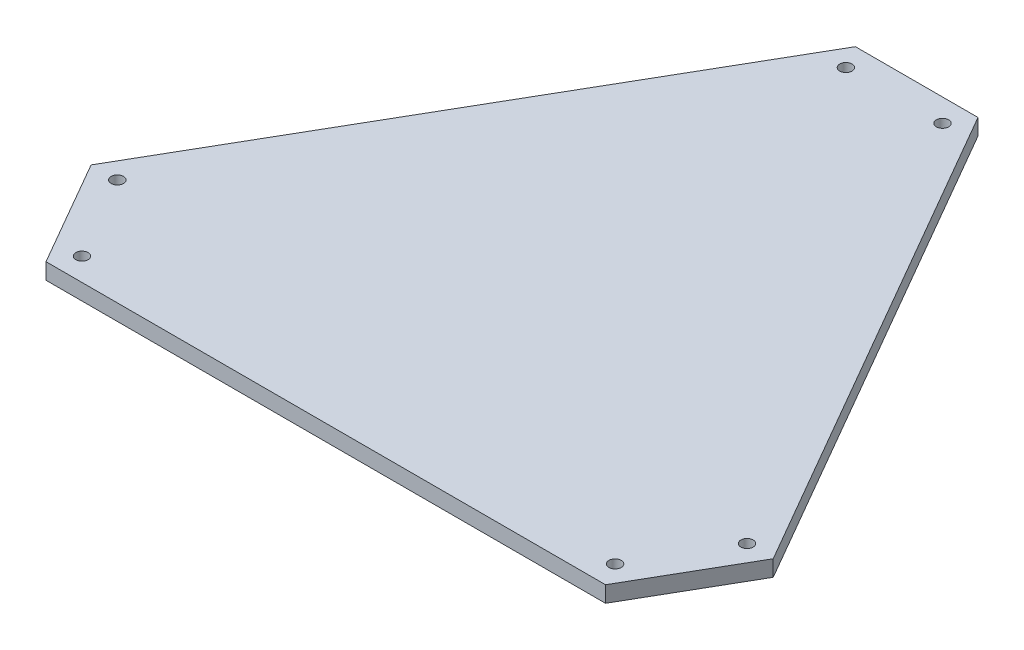
ISO-10303-21;
HEADER;
FILE_DESCRIPTION(('STEP AP214'),'2;1');
FILE_NAME('part.step','',(''),(''),'','','');
FILE_SCHEMA(('AUTOMOTIVE_DESIGN { 1 0 10303 214 1 1 1 1 }'));
ENDSEC;
DATA;
#1=APPLICATION_CONTEXT('core data for automotive mechanical design processes');
#2=APPLICATION_PROTOCOL_DEFINITION('international standard','automotive_design',2000,#1);
#3=PRODUCT_CONTEXT('',#1,'mechanical');
#4=PRODUCT('Part','Part','',(#3));
#5=PRODUCT_RELATED_PRODUCT_CATEGORY('part','',(#4));
#6=PRODUCT_DEFINITION_FORMATION('','',#4);
#7=PRODUCT_DEFINITION_CONTEXT('part definition',#1,'design');
#8=PRODUCT_DEFINITION('design','',#6,#7);
#9=PRODUCT_DEFINITION_SHAPE('','',#8);
#10=(LENGTH_UNIT() NAMED_UNIT(*) SI_UNIT(.MILLI.,.METRE.));
#11=(NAMED_UNIT(*) PLANE_ANGLE_UNIT() SI_UNIT($,.RADIAN.));
#12=(NAMED_UNIT(*) SI_UNIT($,.STERADIAN.) SOLID_ANGLE_UNIT());
#13=UNCERTAINTY_MEASURE_WITH_UNIT(LENGTH_MEASURE(1.E-05),#10,'distance_accuracy_value','');
#14=(GEOMETRIC_REPRESENTATION_CONTEXT(3) GLOBAL_UNCERTAINTY_ASSIGNED_CONTEXT((#13)) GLOBAL_UNIT_ASSIGNED_CONTEXT((#10,
#11,#12)) REPRESENTATION_CONTEXT('',''));
#15=CARTESIAN_POINT('',(0.,0.,0.));
#16=DIRECTION('',(0.,0.,1.));
#17=DIRECTION('',(1.,0.,0.));
#18=AXIS2_PLACEMENT_3D('',#15,#16,#17);
#19=CARTESIAN_POINT('',(0.,3.,-129.9));
#20=DIRECTION('',(-0.866019052628739,0.,0.500011000363013));
#21=DIRECTION('',(0.500011000363013,0.,0.866019052628739));
#22=AXIS2_PLACEMENT_3D('',#19,#20,#21);
#23=PLANE('',#22);
#24=DIRECTION('',(-0.500011000363013,0.,-0.866019052628739));
#25=VECTOR('',#24,1.);
#26=CARTESIAN_POINT('',(0.,3.,-129.9));
#27=LINE('',#26,#25);
#28=CARTESIAN_POINT('',(63.5566639869683,3.,-19.8198579745709));
#29=VERTEX_POINT('',#28);
#30=CARTESIAN_POINT('',(11.421585635486,3.,-110.117813679338));
#31=VERTEX_POINT('',#30);
#32=EDGE_CURVE('E104',#29,#31,#27,.T.);
#33=ORIENTED_EDGE('',*,*,#32,.F.);
#34=DIRECTION('',(0.,1.,0.));
#35=VECTOR('',#34,1.);
#36=CARTESIAN_POINT('',(63.5566639869683,0.,-19.8198579745709));
#37=LINE('',#36,#35);
#38=CARTESIAN_POINT('',(63.5566639869683,0.,-19.8198579745709));
#39=VERTEX_POINT('',#38);
#40=EDGE_CURVE('E90',#39,#29,#37,.T.);
#41=ORIENTED_EDGE('',*,*,#40,.F.);
#42=DIRECTION('',(-0.500011000363013,0.,-0.866019052628739));
#43=VECTOR('',#42,1.);
#44=CARTESIAN_POINT('',(0.,0.,-129.9));
#45=LINE('',#44,#43);
#46=CARTESIAN_POINT('',(11.421585635486,0.,-110.117813679338));
#47=VERTEX_POINT('',#46);
#48=EDGE_CURVE('E102',#39,#47,#45,.T.);
#49=ORIENTED_EDGE('',*,*,#48,.T.);
#50=DIRECTION('',(0.,1.,0.));
#51=VECTOR('',#50,1.);
#52=CARTESIAN_POINT('',(11.421585635486,0.,-110.117813679338));
#53=LINE('',#52,#51);
#54=EDGE_CURVE('E120',#47,#31,#53,.T.);
#55=ORIENTED_EDGE('',*,*,#54,.T.);
#56=EDGE_LOOP('',(#33,#41,#49,#55));
#57=FACE_BOUND('',#56,.T.);
#58=ADVANCED_FACE('F36',(#57),#23,.F.);
#59=CARTESIAN_POINT('',(0.,3.,-129.9));
#60=DIRECTION('',(0.866019052628739,0.,0.500011000363013));
#61=DIRECTION('',(0.500011000363013,0.,-0.866019052628739));
#62=AXIS2_PLACEMENT_3D('',#59,#60,#61);
#63=PLANE('',#62);
#64=DIRECTION('',(-0.500011000363013,0.,0.866019052628739));
#65=VECTOR('',#64,1.);
#66=CARTESIAN_POINT('',(0.,0.,-129.9));
#67=LINE('',#66,#65);
#68=CARTESIAN_POINT('',(-11.421585635486,0.,-110.117813679338));
#69=VERTEX_POINT('',#68);
#70=CARTESIAN_POINT('',(-63.5566639869683,0.,-19.8198579745709));
#71=VERTEX_POINT('',#70);
#72=EDGE_CURVE('E110',#69,#71,#67,.T.);
#73=ORIENTED_EDGE('',*,*,#72,.T.);
#74=DIRECTION('',(0.,1.,0.));
#75=VECTOR('',#74,1.);
#76=CARTESIAN_POINT('',(-63.5566639869683,0.,-19.8198579745709));
#77=LINE('',#76,#75);
#78=CARTESIAN_POINT('',(-63.5566639869683,3.,-19.8198579745709));
#79=VERTEX_POINT('',#78);
#80=EDGE_CURVE('E52',#71,#79,#77,.T.);
#81=ORIENTED_EDGE('',*,*,#80,.T.);
#82=DIRECTION('',(-0.500011000363013,0.,0.866019052628739));
#83=VECTOR('',#82,1.);
#84=CARTESIAN_POINT('',(0.,3.,-129.9));
#85=LINE('',#84,#83);
#86=CARTESIAN_POINT('',(-11.421585635486,3.,-110.117813679338));
#87=VERTEX_POINT('',#86);
#88=EDGE_CURVE('E44',#87,#79,#85,.T.);
#89=ORIENTED_EDGE('',*,*,#88,.F.);
#90=DIRECTION('',(0.,1.,0.));
#91=VECTOR('',#90,1.);
#92=CARTESIAN_POINT('',(-11.421585635486,0.,-110.117813679338));
#93=LINE('',#92,#91);
#94=EDGE_CURVE('E118',#69,#87,#93,.T.);
#95=ORIENTED_EDGE('',*,*,#94,.F.);
#96=EDGE_LOOP('',(#73,#81,#89,#95));
#97=FACE_BOUND('',#96,.T.);
#98=ADVANCED_FACE('F186',(#97),#63,.F.);
#99=CARTESIAN_POINT('',(-75.,3.,0.));
#100=DIRECTION('',(0.,0.,-1.));
#101=DIRECTION('',(-1.,0.,0.));
#102=AXIS2_PLACEMENT_3D('',#99,#100,#101);
#103=PLANE('',#102);
#104=DIRECTION('',(1.,0.,0.));
#105=VECTOR('',#104,1.);
#106=CARTESIAN_POINT('',(-75.,0.,0.));
#107=LINE('',#106,#105);
#108=CARTESIAN_POINT('',(-52.1412157937842,0.,0.));
#109=VERTEX_POINT('',#108);
#110=CARTESIAN_POINT('',(52.1282053195307,0.,0.));
#111=VERTEX_POINT('',#110);
#112=EDGE_CURVE('E39',#109,#111,#107,.T.);
#113=ORIENTED_EDGE('',*,*,#112,.T.);
#114=DIRECTION('',(0.,1.,0.));
#115=VECTOR('',#114,1.);
#116=CARTESIAN_POINT('',(52.1282053195307,0.,0.));
#117=LINE('',#116,#115);
#118=CARTESIAN_POINT('',(52.1282053195307,3.,0.));
#119=VERTEX_POINT('',#118);
#120=EDGE_CURVE('E60',#111,#119,#117,.T.);
#121=ORIENTED_EDGE('',*,*,#120,.T.);
#122=DIRECTION('',(1.,0.,0.));
#123=VECTOR('',#122,1.);
#124=CARTESIAN_POINT('',(-75.,3.,0.));
#125=LINE('',#124,#123);
#126=CARTESIAN_POINT('',(-52.1412157937842,3.,0.));
#127=VERTEX_POINT('',#126);
#128=EDGE_CURVE('E11',#127,#119,#125,.T.);
#129=ORIENTED_EDGE('',*,*,#128,.F.);
#130=DIRECTION('',(0.,1.,0.));
#131=VECTOR('',#130,1.);
#132=CARTESIAN_POINT('',(-52.1412157937842,0.,0.));
#133=LINE('',#132,#131);
#134=EDGE_CURVE('E127',#109,#127,#133,.T.);
#135=ORIENTED_EDGE('',*,*,#134,.F.);
#136=EDGE_LOOP('',(#113,#121,#129,#135));
#137=FACE_BOUND('',#136,.T.);
#138=ADVANCED_FACE('F175',(#137),#103,.F.);
#139=CARTESIAN_POINT('',(0.,3.,0.));
#140=DIRECTION('',(0.,-1.,0.));
#141=DIRECTION('',(0.,0.,-1.));
#142=AXIS2_PLACEMENT_3D('',#139,#140,#141);
#143=PLANE('',#142);
#144=CARTESIAN_POINT('',(-8.94353489196787,3.,-105.86579745118));
#145=DIRECTION('',(0.,1.,0.));
#146=DIRECTION('',(0.,0.,1.));
#147=AXIS2_PLACEMENT_3D('',#144,#145,#146);
#148=CIRCLE('',#147,1.14999800879908);
#149=CARTESIAN_POINT('',(-8.94353489196787,3.,-104.715799442381));
#150=VERTEX_POINT('',#149);
#151=EDGE_CURVE('E155',#150,#150,#148,.T.);
#152=ORIENTED_EDGE('',*,*,#151,.F.);
#153=EDGE_LOOP('',(#152));
#154=FACE_BOUND('',#153,.T.);
#155=CARTESIAN_POINT('',(58.6617615194191,3.,-19.8373091403831));
#156=DIRECTION('',(0.,1.,0.));
#157=DIRECTION('',(0.,0.,1.));
#158=AXIS2_PLACEMENT_3D('',#155,#156,#157);
#159=CIRCLE('',#158,1.15);
#160=CARTESIAN_POINT('',(58.6617615194191,3.,-18.6873091403831));
#161=VERTEX_POINT('',#160);
#162=EDGE_CURVE('E144',#161,#161,#159,.T.);
#163=ORIENTED_EDGE('',*,*,#162,.F.);
#164=EDGE_LOOP('',(#163));
#165=FACE_BOUND('',#164,.T.);
#166=CARTESIAN_POINT('',(49.6617615194193,3.,-4.2488518722631));
#167=DIRECTION('',(0.,1.,0.));
#168=DIRECTION('',(0.,0.,1.));
#169=AXIS2_PLACEMENT_3D('',#166,#167,#168);
#170=CIRCLE('',#169,1.15);
#171=CARTESIAN_POINT('',(49.6617615194193,3.,-3.0988518722631));
#172=VERTEX_POINT('',#171);
#173=EDGE_CURVE('E143',#172,#172,#170,.T.);
#174=ORIENTED_EDGE('',*,*,#173,.F.);
#175=EDGE_LOOP('',(#174));
#176=FACE_BOUND('',#175,.T.);
#177=CARTESIAN_POINT('',(-58.6879897210115,3.,-19.8388309040406));
#178=DIRECTION('',(0.,1.,0.));
#179=DIRECTION('',(0.,0.,1.));
#180=AXIS2_PLACEMENT_3D('',#177,#178,#179);
#181=CIRCLE('',#180,1.15);
#182=CARTESIAN_POINT('',(-58.6879897210115,3.,-18.6888309040406));
#183=VERTEX_POINT('',#182);
#184=EDGE_CURVE('E137',#183,#183,#181,.T.);
#185=ORIENTED_EDGE('',*,*,#184,.F.);
#186=EDGE_LOOP('',(#185));
#187=FACE_BOUND('',#186,.T.);
#188=CARTESIAN_POINT('',(9.05637457043987,3.,-105.866807250762));
#189=DIRECTION('',(0.,1.,0.));
#190=DIRECTION('',(0.,0.,1.));
#191=AXIS2_PLACEMENT_3D('',#188,#189,#190);
#192=CIRCLE('',#191,1.14999378654726);
#193=CARTESIAN_POINT('',(9.05637457043987,3.,-104.716813464214));
#194=VERTEX_POINT('',#193);
#195=EDGE_CURVE('E156',#194,#194,#192,.T.);
#196=ORIENTED_EDGE('',*,*,#195,.F.);
#197=EDGE_LOOP('',(#196));
#198=FACE_BOUND('',#197,.T.);
#199=CARTESIAN_POINT('',(-49.6879897210114,3.,-4.25037363592079));
#200=DIRECTION('',(0.,1.,0.));
#201=DIRECTION('',(0.,0.,1.));
#202=AXIS2_PLACEMENT_3D('',#199,#200,#201);
#203=CIRCLE('',#202,1.15);
#204=CARTESIAN_POINT('',(-49.6879897210114,3.,-3.10037363592079));
#205=VERTEX_POINT('',#204);
#206=EDGE_CURVE('E134',#205,#205,#203,.T.);
#207=ORIENTED_EDGE('',*,*,#206,.F.);
#208=EDGE_LOOP('',(#207));
#209=FACE_BOUND('',#208,.T.);
#210=ORIENTED_EDGE('',*,*,#128,.T.);
#211=DIRECTION('',(-0.499523226003709,0.,0.866300494449154));
#212=VECTOR('',#211,1.);
#213=CARTESIAN_POINT('',(52.1282053195307,3.,0.));
#214=LINE('',#213,#212);
#215=EDGE_CURVE('E96',#29,#119,#214,.T.);
#216=ORIENTED_EDGE('',*,*,#215,.F.);
#217=ORIENTED_EDGE('',*,*,#32,.T.);
#218=DIRECTION('',(1.,0.,0.));
#219=VECTOR('',#218,1.);
#220=CARTESIAN_POINT('',(-11.421585635486,3.,-110.117813679338));
#221=LINE('',#220,#219);
#222=EDGE_CURVE('E123',#87,#31,#221,.T.);
#223=ORIENTED_EDGE('',*,*,#222,.F.);
#224=ORIENTED_EDGE('',*,*,#88,.T.);
#225=DIRECTION('',(-0.499096269822187,0.,-0.866546544306524));
#226=VECTOR('',#225,1.);
#227=CARTESIAN_POINT('',(-52.1412157937842,3.,0.));
#228=LINE('',#227,#226);
#229=EDGE_CURVE('E122',#127,#79,#228,.T.);
#230=ORIENTED_EDGE('',*,*,#229,.F.);
#231=EDGE_LOOP('',(#210,#216,#217,#223,#224,#230));
#232=FACE_BOUND('',#231,.T.);
#233=ADVANCED_FACE('F172',(#154,#165,#176,#187,#198,#209,#232),#143,.F.);
#234=CARTESIAN_POINT('',(0.,0.,0.));
#235=DIRECTION('',(0.,-1.,0.));
#236=DIRECTION('',(0.,0.,-1.));
#237=AXIS2_PLACEMENT_3D('',#234,#235,#236);
#238=PLANE('',#237);
#239=CARTESIAN_POINT('',(-8.94353489196787,0.,-105.86579745118));
#240=DIRECTION('',(0.,1.,0.));
#241=DIRECTION('',(0.,0.,1.));
#242=AXIS2_PLACEMENT_3D('',#239,#240,#241);
#243=CIRCLE('',#242,1.14999800879908);
#244=CARTESIAN_POINT('',(-8.94353489196787,0.,-104.715799442381));
#245=VERTEX_POINT('',#244);
#246=EDGE_CURVE('E152',#245,#245,#243,.T.);
#247=ORIENTED_EDGE('',*,*,#246,.T.);
#248=EDGE_LOOP('',(#247));
#249=FACE_BOUND('',#248,.T.);
#250=CARTESIAN_POINT('',(58.6617615194191,0.,-19.8373091403831));
#251=DIRECTION('',(0.,1.,0.));
#252=DIRECTION('',(0.,0.,1.));
#253=AXIS2_PLACEMENT_3D('',#250,#251,#252);
#254=CIRCLE('',#253,1.15);
#255=CARTESIAN_POINT('',(58.6617615194191,0.,-18.6873091403831));
#256=VERTEX_POINT('',#255);
#257=EDGE_CURVE('E159',#256,#256,#254,.T.);
#258=ORIENTED_EDGE('',*,*,#257,.T.);
#259=EDGE_LOOP('',(#258));
#260=FACE_BOUND('',#259,.T.);
#261=CARTESIAN_POINT('',(49.6617615194193,0.,-4.2488518722631));
#262=DIRECTION('',(0.,1.,0.));
#263=DIRECTION('',(0.,0.,1.));
#264=AXIS2_PLACEMENT_3D('',#261,#262,#263);
#265=CIRCLE('',#264,1.15);
#266=CARTESIAN_POINT('',(49.6617615194193,0.,-3.0988518722631));
#267=VERTEX_POINT('',#266);
#268=EDGE_CURVE('E140',#267,#267,#265,.T.);
#269=ORIENTED_EDGE('',*,*,#268,.T.);
#270=EDGE_LOOP('',(#269));
#271=FACE_BOUND('',#270,.T.);
#272=CARTESIAN_POINT('',(-58.6879897210115,0.,-19.8388309040406));
#273=DIRECTION('',(0.,1.,0.));
#274=DIRECTION('',(0.,0.,1.));
#275=AXIS2_PLACEMENT_3D('',#272,#273,#274);
#276=CIRCLE('',#275,1.15);
#277=CARTESIAN_POINT('',(-58.6879897210115,0.,-18.6888309040406));
#278=VERTEX_POINT('',#277);
#279=EDGE_CURVE('E147',#278,#278,#276,.T.);
#280=ORIENTED_EDGE('',*,*,#279,.T.);
#281=EDGE_LOOP('',(#280));
#282=FACE_BOUND('',#281,.T.);
#283=CARTESIAN_POINT('',(9.05637457043987,0.,-105.866807250762));
#284=DIRECTION('',(0.,1.,0.));
#285=DIRECTION('',(0.,0.,1.));
#286=AXIS2_PLACEMENT_3D('',#283,#284,#285);
#287=CIRCLE('',#286,1.14999378654726);
#288=CARTESIAN_POINT('',(9.05637457043987,0.,-104.716813464214));
#289=VERTEX_POINT('',#288);
#290=EDGE_CURVE('E164',#289,#289,#287,.T.);
#291=ORIENTED_EDGE('',*,*,#290,.T.);
#292=EDGE_LOOP('',(#291));
#293=FACE_BOUND('',#292,.T.);
#294=CARTESIAN_POINT('',(-49.6879897210114,0.,-4.25037363592079));
#295=DIRECTION('',(0.,1.,0.));
#296=DIRECTION('',(0.,0.,1.));
#297=AXIS2_PLACEMENT_3D('',#294,#295,#296);
#298=CIRCLE('',#297,1.15);
#299=CARTESIAN_POINT('',(-49.6879897210114,0.,-3.10037363592079));
#300=VERTEX_POINT('',#299);
#301=EDGE_CURVE('E125',#300,#300,#298,.T.);
#302=ORIENTED_EDGE('',*,*,#301,.T.);
#303=EDGE_LOOP('',(#302));
#304=FACE_BOUND('',#303,.T.);
#305=DIRECTION('',(-0.499523226003709,0.,0.866300494449154));
#306=VECTOR('',#305,1.);
#307=CARTESIAN_POINT('',(52.1282053195307,0.,0.));
#308=LINE('',#307,#306);
#309=EDGE_CURVE('E87',#39,#111,#308,.T.);
#310=ORIENTED_EDGE('',*,*,#309,.T.);
#311=ORIENTED_EDGE('',*,*,#112,.F.);
#312=DIRECTION('',(-0.499096269822187,0.,-0.866546544306524));
#313=VECTOR('',#312,1.);
#314=CARTESIAN_POINT('',(-52.1412157937842,0.,0.));
#315=LINE('',#314,#313);
#316=EDGE_CURVE('E129',#109,#71,#315,.T.);
#317=ORIENTED_EDGE('',*,*,#316,.T.);
#318=ORIENTED_EDGE('',*,*,#72,.F.);
#319=DIRECTION('',(1.,0.,0.));
#320=VECTOR('',#319,1.);
#321=CARTESIAN_POINT('',(-11.421585635486,0.,-110.117813679338));
#322=LINE('',#321,#320);
#323=EDGE_CURVE('E109',#69,#47,#322,.T.);
#324=ORIENTED_EDGE('',*,*,#323,.T.);
#325=ORIENTED_EDGE('',*,*,#48,.F.);
#326=EDGE_LOOP('',(#310,#311,#317,#318,#324,#325));
#327=FACE_BOUND('',#326,.T.);
#328=ADVANCED_FACE('F107',(#249,#260,#271,#282,#293,#304,#327),#238,.T.);
#329=CARTESIAN_POINT('',(-11.421585635486,0.,-110.117813679338));
#330=DIRECTION('',(0.,0.,1.));
#331=DIRECTION('',(1.,0.,0.));
#332=AXIS2_PLACEMENT_3D('',#329,#330,#331);
#333=PLANE('',#332);
#334=ORIENTED_EDGE('',*,*,#222,.T.);
#335=ORIENTED_EDGE('',*,*,#54,.F.);
#336=ORIENTED_EDGE('',*,*,#323,.F.);
#337=ORIENTED_EDGE('',*,*,#94,.T.);
#338=EDGE_LOOP('',(#334,#335,#336,#337));
#339=FACE_BOUND('',#338,.T.);
#340=ADVANCED_FACE('F190',(#339),#333,.F.);
#341=CARTESIAN_POINT('',(-52.1412157937842,0.,0.));
#342=DIRECTION('',(0.866546544306524,0.,-0.499096269822187));
#343=DIRECTION('',(-0.499096269822187,0.,-0.866546544306524));
#344=AXIS2_PLACEMENT_3D('',#341,#342,#343);
#345=PLANE('',#344);
#346=ORIENTED_EDGE('',*,*,#229,.T.);
#347=ORIENTED_EDGE('',*,*,#80,.F.);
#348=ORIENTED_EDGE('',*,*,#316,.F.);
#349=ORIENTED_EDGE('',*,*,#134,.T.);
#350=EDGE_LOOP('',(#346,#347,#348,#349));
#351=FACE_BOUND('',#350,.T.);
#352=ADVANCED_FACE('F192',(#351),#345,.F.);
#353=CARTESIAN_POINT('',(52.1282053195307,0.,0.));
#354=DIRECTION('',(-0.866300494449154,0.,-0.499523226003708));
#355=DIRECTION('',(-0.499523226003708,0.,0.866300494449154));
#356=AXIS2_PLACEMENT_3D('',#353,#354,#355);
#357=PLANE('',#356);
#358=ORIENTED_EDGE('',*,*,#215,.T.);
#359=ORIENTED_EDGE('',*,*,#120,.F.);
#360=ORIENTED_EDGE('',*,*,#309,.F.);
#361=ORIENTED_EDGE('',*,*,#40,.T.);
#362=EDGE_LOOP('',(#358,#359,#360,#361));
#363=FACE_BOUND('',#362,.T.);
#364=ADVANCED_FACE('F89',(#363),#357,.F.);
#365=CARTESIAN_POINT('',(-49.6879897210114,0.,-4.25037363592079));
#366=DIRECTION('',(0.,1.,0.));
#367=DIRECTION('',(0.,0.,1.));
#368=AXIS2_PLACEMENT_3D('',#365,#366,#367);
#369=CYLINDRICAL_SURFACE('',#368,1.15);
#370=ORIENTED_EDGE('',*,*,#301,.F.);
#371=EDGE_LOOP('',(#370));
#372=FACE_BOUND('',#371,.T.);
#373=ORIENTED_EDGE('',*,*,#206,.T.);
#374=EDGE_LOOP('',(#373));
#375=FACE_BOUND('',#374,.T.);
#376=ADVANCED_FACE('F226',(#372,#375),#369,.F.);
#377=CARTESIAN_POINT('',(9.05637457043987,0.,-105.866807250762));
#378=DIRECTION('',(0.,1.,0.));
#379=DIRECTION('',(0.,0.,1.));
#380=AXIS2_PLACEMENT_3D('',#377,#378,#379);
#381=CYLINDRICAL_SURFACE('',#380,1.14999378654726);
#382=ORIENTED_EDGE('',*,*,#290,.F.);
#383=EDGE_LOOP('',(#382));
#384=FACE_BOUND('',#383,.T.);
#385=ORIENTED_EDGE('',*,*,#195,.T.);
#386=EDGE_LOOP('',(#385));
#387=FACE_BOUND('',#386,.T.);
#388=ADVANCED_FACE('F170',(#384,#387),#381,.F.);
#389=CARTESIAN_POINT('',(-58.6879897210115,0.,-19.8388309040406));
#390=DIRECTION('',(0.,1.,0.));
#391=DIRECTION('',(0.,0.,1.));
#392=AXIS2_PLACEMENT_3D('',#389,#390,#391);
#393=CYLINDRICAL_SURFACE('',#392,1.15);
#394=ORIENTED_EDGE('',*,*,#279,.F.);
#395=EDGE_LOOP('',(#394));
#396=FACE_BOUND('',#395,.T.);
#397=ORIENTED_EDGE('',*,*,#184,.T.);
#398=EDGE_LOOP('',(#397));
#399=FACE_BOUND('',#398,.T.);
#400=ADVANCED_FACE('F242',(#396,#399),#393,.F.);
#401=CARTESIAN_POINT('',(49.6617615194193,0.,-4.2488518722631));
#402=DIRECTION('',(0.,1.,0.));
#403=DIRECTION('',(0.,0.,1.));
#404=AXIS2_PLACEMENT_3D('',#401,#402,#403);
#405=CYLINDRICAL_SURFACE('',#404,1.15);
#406=ORIENTED_EDGE('',*,*,#268,.F.);
#407=EDGE_LOOP('',(#406));
#408=FACE_BOUND('',#407,.T.);
#409=ORIENTED_EDGE('',*,*,#173,.T.);
#410=EDGE_LOOP('',(#409));
#411=FACE_BOUND('',#410,.T.);
#412=ADVANCED_FACE('F252',(#408,#411),#405,.F.);
#413=CARTESIAN_POINT('',(58.6617615194191,0.,-19.8373091403831));
#414=DIRECTION('',(0.,1.,0.));
#415=DIRECTION('',(0.,0.,1.));
#416=AXIS2_PLACEMENT_3D('',#413,#414,#415);
#417=CYLINDRICAL_SURFACE('',#416,1.15);
#418=ORIENTED_EDGE('',*,*,#257,.F.);
#419=EDGE_LOOP('',(#418));
#420=FACE_BOUND('',#419,.T.);
#421=ORIENTED_EDGE('',*,*,#162,.T.);
#422=EDGE_LOOP('',(#421));
#423=FACE_BOUND('',#422,.T.);
#424=ADVANCED_FACE('F262',(#420,#423),#417,.F.);
#425=CARTESIAN_POINT('',(-8.94353489196787,0.,-105.86579745118));
#426=DIRECTION('',(0.,1.,0.));
#427=DIRECTION('',(0.,0.,1.));
#428=AXIS2_PLACEMENT_3D('',#425,#426,#427);
#429=CYLINDRICAL_SURFACE('',#428,1.14999800879908);
#430=ORIENTED_EDGE('',*,*,#246,.F.);
#431=EDGE_LOOP('',(#430));
#432=FACE_BOUND('',#431,.T.);
#433=ORIENTED_EDGE('',*,*,#151,.T.);
#434=EDGE_LOOP('',(#433));
#435=FACE_BOUND('',#434,.T.);
#436=ADVANCED_FACE('F272',(#432,#435),#429,.F.);
#437=CLOSED_SHELL('',(#58,#98,#138,#233,#328,#340,#352,#364,#376,#388,#400,#412,#424,#436));
#438=MANIFOLD_SOLID_BREP('B2',#437);
#439=ADVANCED_BREP_SHAPE_REPRESENTATION('',(#18,#438),#14);
#440=SHAPE_DEFINITION_REPRESENTATION(#9,#439);
ENDSEC;
END-ISO-10303-21;
